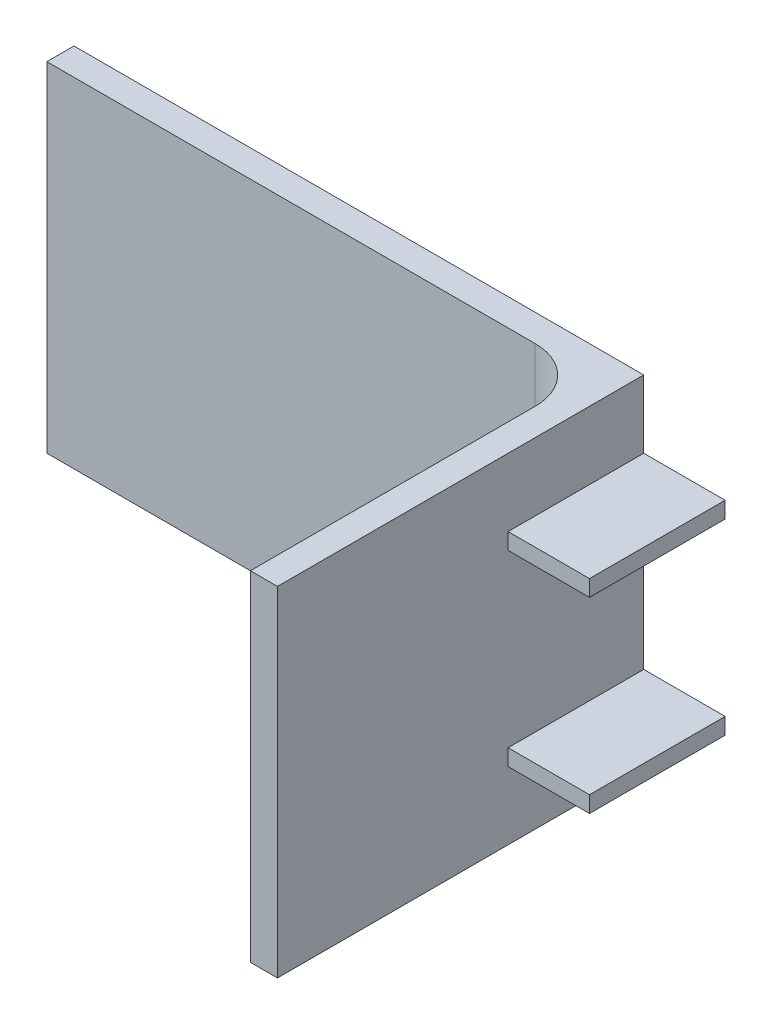
ISO-10303-21;
HEADER;
FILE_DESCRIPTION(('STEP AP214'),'2;1');
FILE_NAME('part.step','',(''),(''),'','','');
FILE_SCHEMA(('AUTOMOTIVE_DESIGN { 1 0 10303 214 1 1 1 1 }'));
ENDSEC;
DATA;
#1=APPLICATION_CONTEXT('core data for automotive mechanical design processes');
#2=APPLICATION_PROTOCOL_DEFINITION('international standard','automotive_design',2000,#1);
#3=PRODUCT_CONTEXT('',#1,'mechanical');
#4=PRODUCT('Part','Part','',(#3));
#5=PRODUCT_RELATED_PRODUCT_CATEGORY('part','',(#4));
#6=PRODUCT_DEFINITION_FORMATION('','',#4);
#7=PRODUCT_DEFINITION_CONTEXT('part definition',#1,'design');
#8=PRODUCT_DEFINITION('design','',#6,#7);
#9=PRODUCT_DEFINITION_SHAPE('','',#8);
#10=(LENGTH_UNIT() NAMED_UNIT(*) SI_UNIT(.MILLI.,.METRE.));
#11=(NAMED_UNIT(*) PLANE_ANGLE_UNIT() SI_UNIT($,.RADIAN.));
#12=(NAMED_UNIT(*) SI_UNIT($,.STERADIAN.) SOLID_ANGLE_UNIT());
#13=UNCERTAINTY_MEASURE_WITH_UNIT(LENGTH_MEASURE(1.E-05),#10,'distance_accuracy_value','');
#14=(GEOMETRIC_REPRESENTATION_CONTEXT(3) GLOBAL_UNCERTAINTY_ASSIGNED_CONTEXT((#13)) GLOBAL_UNIT_ASSIGNED_CONTEXT((#10,
#11,#12)) REPRESENTATION_CONTEXT('',''));
#15=CARTESIAN_POINT('',(0.,0.,0.));
#16=DIRECTION('',(0.,0.,1.));
#17=DIRECTION('',(1.,0.,0.));
#18=AXIS2_PLACEMENT_3D('',#15,#16,#17);
#19=CARTESIAN_POINT('',(0.,25.,2.));
#20=DIRECTION('',(-1.,0.,0.));
#21=DIRECTION('',(0.,0.,1.));
#22=AXIS2_PLACEMENT_3D('',#19,#20,#21);
#23=PLANE('',#22);
#24=DIRECTION('',(0.,0.,1.));
#25=VECTOR('',#24,1.);
#26=CARTESIAN_POINT('',(0.,6.2,0.));
#27=LINE('',#26,#25);
#28=CARTESIAN_POINT('',(0.,6.2,0.));
#29=VERTEX_POINT('',#28);
#30=CARTESIAN_POINT('',(0.,6.2,10.));
#31=VERTEX_POINT('',#30);
#32=EDGE_CURVE('E463',#29,#31,#27,.T.);
#33=ORIENTED_EDGE('',*,*,#32,.F.);
#34=DIRECTION('',(0.,1.,0.));
#35=VECTOR('',#34,1.);
#36=CARTESIAN_POINT('',(0.,25.,0.));
#37=LINE('',#36,#35);
#38=CARTESIAN_POINT('',(0.,18.8,0.));
#39=VERTEX_POINT('',#38);
#40=EDGE_CURVE('E163',#29,#39,#37,.T.);
#41=ORIENTED_EDGE('',*,*,#40,.T.);
#42=DIRECTION('',(0.,0.,-1.));
#43=VECTOR('',#42,1.);
#44=CARTESIAN_POINT('',(0.,18.8,0.));
#45=LINE('',#44,#43);
#46=CARTESIAN_POINT('',(0.,18.8,10.));
#47=VERTEX_POINT('',#46);
#48=EDGE_CURVE('E178',#47,#39,#45,.T.);
#49=ORIENTED_EDGE('',*,*,#48,.F.);
#50=DIRECTION('',(0.,-1.,0.));
#51=VECTOR('',#50,1.);
#52=CARTESIAN_POINT('',(0.,20.,10.));
#53=LINE('',#52,#51);
#54=CARTESIAN_POINT('',(0.,20.,10.));
#55=VERTEX_POINT('',#54);
#56=EDGE_CURVE('E168',#55,#47,#53,.T.);
#57=ORIENTED_EDGE('',*,*,#56,.F.);
#58=DIRECTION('',(0.,0.,1.));
#59=VECTOR('',#58,1.);
#60=CARTESIAN_POINT('',(0.,20.,0.));
#61=LINE('',#60,#59);
#62=CARTESIAN_POINT('',(0.,20.,0.));
#63=VERTEX_POINT('',#62);
#64=EDGE_CURVE('E165',#63,#55,#61,.T.);
#65=ORIENTED_EDGE('',*,*,#64,.F.);
#66=CARTESIAN_POINT('',(0.,25.,0.));
#67=VERTEX_POINT('',#66);
#68=EDGE_CURVE('E203',#63,#67,#37,.T.);
#69=ORIENTED_EDGE('',*,*,#68,.T.);
#70=DIRECTION('',(0.,0.,-1.));
#71=VECTOR('',#70,1.);
#72=CARTESIAN_POINT('',(0.,25.,2.));
#73=LINE('',#72,#71);
#74=CARTESIAN_POINT('',(0.,25.,27.));
#75=VERTEX_POINT('',#74);
#76=EDGE_CURVE('E252',#75,#67,#73,.T.);
#77=ORIENTED_EDGE('',*,*,#76,.F.);
#78=DIRECTION('',(0.,1.,0.));
#79=VECTOR('',#78,1.);
#80=CARTESIAN_POINT('',(0.,25.,27.));
#81=LINE('',#80,#79);
#82=CARTESIAN_POINT('',(0.,0.,27.));
#83=VERTEX_POINT('',#82);
#84=EDGE_CURVE('E277',#83,#75,#81,.T.);
#85=ORIENTED_EDGE('',*,*,#84,.F.);
#86=DIRECTION('',(0.,0.,-1.));
#87=VECTOR('',#86,1.);
#88=CARTESIAN_POINT('',(0.,0.,2.));
#89=LINE('',#88,#87);
#90=CARTESIAN_POINT('',(0.,0.,0.));
#91=VERTEX_POINT('',#90);
#92=EDGE_CURVE('E248',#83,#91,#89,.T.);
#93=ORIENTED_EDGE('',*,*,#92,.T.);
#94=CARTESIAN_POINT('',(0.,5.,0.));
#95=VERTEX_POINT('',#94);
#96=EDGE_CURVE('E202',#91,#95,#37,.T.);
#97=ORIENTED_EDGE('',*,*,#96,.T.);
#98=DIRECTION('',(0.,0.,-1.));
#99=VECTOR('',#98,1.);
#100=CARTESIAN_POINT('',(0.,5.,0.));
#101=LINE('',#100,#99);
#102=CARTESIAN_POINT('',(0.,5.,10.));
#103=VERTEX_POINT('',#102);
#104=EDGE_CURVE('E158',#103,#95,#101,.T.);
#105=ORIENTED_EDGE('',*,*,#104,.F.);
#106=DIRECTION('',(0.,-1.,0.));
#107=VECTOR('',#106,1.);
#108=CARTESIAN_POINT('',(0.,5.,10.));
#109=LINE('',#108,#107);
#110=EDGE_CURVE('E457',#31,#103,#109,.T.);
#111=ORIENTED_EDGE('',*,*,#110,.F.);
#112=EDGE_LOOP('',(#33,#41,#49,#57,#65,#69,#77,#85,#93,#97,#105,#111));
#113=FACE_BOUND('',#112,.T.);
#114=ADVANCED_FACE('F33',(#113),#23,.F.);
#115=CARTESIAN_POINT('',(-42.,25.,2.));
#116=DIRECTION('',(1.,0.,0.));
#117=DIRECTION('',(0.,0.,-1.));
#118=AXIS2_PLACEMENT_3D('',#115,#116,#117);
#119=PLANE('',#118);
#120=DIRECTION('',(0.,-1.,0.));
#121=VECTOR('',#120,1.);
#122=CARTESIAN_POINT('',(-42.,25.,0.));
#123=LINE('',#122,#121);
#124=CARTESIAN_POINT('',(-42.,25.,0.));
#125=VERTEX_POINT('',#124);
#126=CARTESIAN_POINT('',(-42.,0.,0.));
#127=VERTEX_POINT('',#126);
#128=EDGE_CURVE('E223',#125,#127,#123,.T.);
#129=ORIENTED_EDGE('',*,*,#128,.T.);
#130=DIRECTION('',(0.,0.,-1.));
#131=VECTOR('',#130,1.);
#132=CARTESIAN_POINT('',(-42.,0.,2.));
#133=LINE('',#132,#131);
#134=CARTESIAN_POINT('',(-42.,0.,2.));
#135=VERTEX_POINT('',#134);
#136=EDGE_CURVE('E234',#135,#127,#133,.T.);
#137=ORIENTED_EDGE('',*,*,#136,.F.);
#138=DIRECTION('',(0.,-1.,0.));
#139=VECTOR('',#138,1.);
#140=CARTESIAN_POINT('',(-42.,25.,2.));
#141=LINE('',#140,#139);
#142=CARTESIAN_POINT('',(-42.,25.,2.));
#143=VERTEX_POINT('',#142);
#144=EDGE_CURVE('E233',#143,#135,#141,.T.);
#145=ORIENTED_EDGE('',*,*,#144,.F.);
#146=DIRECTION('',(0.,0.,-1.));
#147=VECTOR('',#146,1.);
#148=CARTESIAN_POINT('',(-42.,25.,2.));
#149=LINE('',#148,#147);
#150=EDGE_CURVE('E242',#143,#125,#149,.T.);
#151=ORIENTED_EDGE('',*,*,#150,.T.);
#152=EDGE_LOOP('',(#129,#137,#145,#151));
#153=FACE_BOUND('',#152,.T.);
#154=ADVANCED_FACE('F262',(#153),#119,.F.);
#155=CARTESIAN_POINT('',(-42.,0.,2.));
#156=DIRECTION('',(0.,1.,0.));
#157=DIRECTION('',(0.,0.,1.));
#158=AXIS2_PLACEMENT_3D('',#155,#156,#157);
#159=PLANE('',#158);
#160=DIRECTION('',(1.,0.,0.));
#161=VECTOR('',#160,1.);
#162=CARTESIAN_POINT('',(-42.,0.,0.));
#163=LINE('',#162,#161);
#164=EDGE_CURVE('E209',#127,#91,#163,.T.);
#165=ORIENTED_EDGE('',*,*,#164,.T.);
#166=ORIENTED_EDGE('',*,*,#92,.F.);
#167=DIRECTION('',(1.,0.,0.));
#168=VECTOR('',#167,1.);
#169=CARTESIAN_POINT('',(0.,0.,27.));
#170=LINE('',#169,#168);
#171=CARTESIAN_POINT('',(-2.,0.,27.));
#172=VERTEX_POINT('',#171);
#173=EDGE_CURVE('E228',#172,#83,#170,.T.);
#174=ORIENTED_EDGE('',*,*,#173,.F.);
#175=DIRECTION('',(0.,0.,-1.));
#176=VECTOR('',#175,1.);
#177=CARTESIAN_POINT('',(-2.,0.,27.));
#178=LINE('',#177,#176);
#179=CARTESIAN_POINT('',(-2.,0.,6.));
#180=VERTEX_POINT('',#179);
#181=EDGE_CURVE('E224',#172,#180,#178,.T.);
#182=ORIENTED_EDGE('',*,*,#181,.T.);
#183=CARTESIAN_POINT('',(-6.,0.,6.));
#184=DIRECTION('',(0.,1.,0.));
#185=DIRECTION('',(0.,0.,1.));
#186=AXIS2_PLACEMENT_3D('',#183,#184,#185);
#187=CIRCLE('',#186,4.);
#188=CARTESIAN_POINT('',(-6.00000000000001,0.,2.));
#189=VERTEX_POINT('',#188);
#190=EDGE_CURVE('E41',#180,#189,#187,.T.);
#191=ORIENTED_EDGE('',*,*,#190,.T.);
#192=DIRECTION('',(1.,0.,0.));
#193=VECTOR('',#192,1.);
#194=CARTESIAN_POINT('',(-42.,0.,2.));
#195=LINE('',#194,#193);
#196=EDGE_CURVE('E229',#135,#189,#195,.T.);
#197=ORIENTED_EDGE('',*,*,#196,.F.);
#198=ORIENTED_EDGE('',*,*,#136,.T.);
#199=EDGE_LOOP('',(#165,#166,#174,#182,#191,#197,#198));
#200=FACE_BOUND('',#199,.T.);
#201=ADVANCED_FACE('F287',(#200),#159,.F.);
#202=CARTESIAN_POINT('',(-42.,25.,2.));
#203=DIRECTION('',(0.,-1.,0.));
#204=DIRECTION('',(1.,0.,0.));
#205=AXIS2_PLACEMENT_3D('',#202,#203,#204);
#206=PLANE('',#205);
#207=DIRECTION('',(-1.,0.,0.));
#208=VECTOR('',#207,1.);
#209=CARTESIAN_POINT('',(-42.,25.,0.));
#210=LINE('',#209,#208);
#211=EDGE_CURVE('E211',#67,#125,#210,.T.);
#212=ORIENTED_EDGE('',*,*,#211,.T.);
#213=ORIENTED_EDGE('',*,*,#150,.F.);
#214=DIRECTION('',(-1.,0.,0.));
#215=VECTOR('',#214,1.);
#216=CARTESIAN_POINT('',(-42.,25.,2.));
#217=LINE('',#216,#215);
#218=CARTESIAN_POINT('',(-6.00000000000001,25.,2.));
#219=VERTEX_POINT('',#218);
#220=EDGE_CURVE('E232',#219,#143,#217,.T.);
#221=ORIENTED_EDGE('',*,*,#220,.F.);
#222=CARTESIAN_POINT('',(-6.,25.,6.));
#223=DIRECTION('',(0.,-1.,0.));
#224=DIRECTION('',(1.,0.,0.));
#225=AXIS2_PLACEMENT_3D('',#222,#223,#224);
#226=CIRCLE('',#225,4.);
#227=CARTESIAN_POINT('',(-2.,25.,6.));
#228=VERTEX_POINT('',#227);
#229=EDGE_CURVE('E11',#219,#228,#226,.T.);
#230=ORIENTED_EDGE('',*,*,#229,.T.);
#231=DIRECTION('',(0.,0.,-1.));
#232=VECTOR('',#231,1.);
#233=CARTESIAN_POINT('',(-2.,25.,27.));
#234=LINE('',#233,#232);
#235=CARTESIAN_POINT('',(-2.,25.,27.));
#236=VERTEX_POINT('',#235);
#237=EDGE_CURVE('E220',#236,#228,#234,.T.);
#238=ORIENTED_EDGE('',*,*,#237,.F.);
#239=DIRECTION('',(-1.,0.,0.));
#240=VECTOR('',#239,1.);
#241=CARTESIAN_POINT('',(0.,25.,27.));
#242=LINE('',#241,#240);
#243=EDGE_CURVE('E272',#75,#236,#242,.T.);
#244=ORIENTED_EDGE('',*,*,#243,.F.);
#245=ORIENTED_EDGE('',*,*,#76,.T.);
#246=EDGE_LOOP('',(#212,#213,#221,#230,#238,#244,#245));
#247=FACE_BOUND('',#246,.T.);
#248=ADVANCED_FACE('F270',(#247),#206,.F.);
#249=CARTESIAN_POINT('',(0.,0.,2.));
#250=DIRECTION('',(0.,0.,1.));
#251=DIRECTION('',(1.,0.,0.));
#252=AXIS2_PLACEMENT_3D('',#249,#250,#251);
#253=PLANE('',#252);
#254=ORIENTED_EDGE('',*,*,#196,.T.);
#255=DIRECTION('',(0.,-1.,0.));
#256=VECTOR('',#255,1.);
#257=CARTESIAN_POINT('',(-6.,0.,2.));
#258=LINE('',#257,#256);
#259=EDGE_CURVE('E54',#189,#219,#258,.F.);
#260=ORIENTED_EDGE('',*,*,#259,.T.);
#261=ORIENTED_EDGE('',*,*,#220,.T.);
#262=ORIENTED_EDGE('',*,*,#144,.T.);
#263=EDGE_LOOP('',(#254,#260,#261,#262));
#264=FACE_BOUND('',#263,.T.);
#265=ADVANCED_FACE('F294',(#264),#253,.T.);
#266=CARTESIAN_POINT('',(0.,0.,0.));
#267=DIRECTION('',(0.,0.,1.));
#268=DIRECTION('',(1.,0.,0.));
#269=AXIS2_PLACEMENT_3D('',#266,#267,#268);
#270=PLANE('',#269);
#271=ORIENTED_EDGE('',*,*,#128,.F.);
#272=ORIENTED_EDGE('',*,*,#211,.F.);
#273=ORIENTED_EDGE('',*,*,#68,.F.);
#274=DIRECTION('',(-1.,0.,0.));
#275=VECTOR('',#274,1.);
#276=CARTESIAN_POINT('',(6.,20.,0.));
#277=LINE('',#276,#275);
#278=CARTESIAN_POINT('',(6.,20.,0.));
#279=VERTEX_POINT('',#278);
#280=EDGE_CURVE('E282',#279,#63,#277,.T.);
#281=ORIENTED_EDGE('',*,*,#280,.F.);
#282=DIRECTION('',(0.,1.,0.));
#283=VECTOR('',#282,1.);
#284=CARTESIAN_POINT('',(6.,20.,0.));
#285=LINE('',#284,#283);
#286=CARTESIAN_POINT('',(6.,18.8,0.));
#287=VERTEX_POINT('',#286);
#288=EDGE_CURVE('E174',#287,#279,#285,.T.);
#289=ORIENTED_EDGE('',*,*,#288,.F.);
#290=DIRECTION('',(-1.,0.,0.));
#291=VECTOR('',#290,1.);
#292=CARTESIAN_POINT('',(6.,18.8,0.));
#293=LINE('',#292,#291);
#294=EDGE_CURVE('E184',#287,#39,#293,.T.);
#295=ORIENTED_EDGE('',*,*,#294,.T.);
#296=ORIENTED_EDGE('',*,*,#40,.F.);
#297=DIRECTION('',(-1.,0.,0.));
#298=VECTOR('',#297,1.);
#299=CARTESIAN_POINT('',(6.,6.2,0.));
#300=LINE('',#299,#298);
#301=CARTESIAN_POINT('',(6.,6.2,0.));
#302=VERTEX_POINT('',#301);
#303=EDGE_CURVE('E143',#302,#29,#300,.T.);
#304=ORIENTED_EDGE('',*,*,#303,.F.);
#305=DIRECTION('',(0.,1.,0.));
#306=VECTOR('',#305,1.);
#307=CARTESIAN_POINT('',(6.,5.,0.));
#308=LINE('',#307,#306);
#309=CARTESIAN_POINT('',(6.,5.,0.));
#310=VERTEX_POINT('',#309);
#311=EDGE_CURVE('E149',#310,#302,#308,.T.);
#312=ORIENTED_EDGE('',*,*,#311,.F.);
#313=DIRECTION('',(-1.,0.,0.));
#314=VECTOR('',#313,1.);
#315=CARTESIAN_POINT('',(6.,5.,0.));
#316=LINE('',#315,#314);
#317=EDGE_CURVE('E454',#310,#95,#316,.T.);
#318=ORIENTED_EDGE('',*,*,#317,.T.);
#319=ORIENTED_EDGE('',*,*,#96,.F.);
#320=ORIENTED_EDGE('',*,*,#164,.F.);
#321=EDGE_LOOP('',(#271,#272,#273,#281,#289,#295,#296,#304,#312,#318,#319,#320));
#322=FACE_BOUND('',#321,.T.);
#323=ADVANCED_FACE('F161',(#322),#270,.F.);
#324=CARTESIAN_POINT('',(-2.,25.,27.));
#325=DIRECTION('',(1.,0.,0.));
#326=DIRECTION('',(0.,1.,0.));
#327=AXIS2_PLACEMENT_3D('',#324,#325,#326);
#328=PLANE('',#327);
#329=ORIENTED_EDGE('',*,*,#237,.T.);
#330=DIRECTION('',(0.,-1.,0.));
#331=VECTOR('',#330,1.);
#332=CARTESIAN_POINT('',(-2.,25.,6.));
#333=LINE('',#332,#331);
#334=EDGE_CURVE('E204',#228,#180,#333,.T.);
#335=ORIENTED_EDGE('',*,*,#334,.T.);
#336=ORIENTED_EDGE('',*,*,#181,.F.);
#337=DIRECTION('',(0.,-1.,0.));
#338=VECTOR('',#337,1.);
#339=CARTESIAN_POINT('',(-2.,25.,27.));
#340=LINE('',#339,#338);
#341=EDGE_CURVE('E276',#236,#172,#340,.T.);
#342=ORIENTED_EDGE('',*,*,#341,.F.);
#343=EDGE_LOOP('',(#329,#335,#336,#342));
#344=FACE_BOUND('',#343,.T.);
#345=ADVANCED_FACE('F286',(#344),#328,.F.);
#346=CARTESIAN_POINT('',(0.,0.,27.));
#347=DIRECTION('',(0.,0.,-1.));
#348=DIRECTION('',(-1.,0.,0.));
#349=AXIS2_PLACEMENT_3D('',#346,#347,#348);
#350=PLANE('',#349);
#351=ORIENTED_EDGE('',*,*,#84,.T.);
#352=ORIENTED_EDGE('',*,*,#243,.T.);
#353=ORIENTED_EDGE('',*,*,#341,.T.);
#354=ORIENTED_EDGE('',*,*,#173,.T.);
#355=EDGE_LOOP('',(#351,#352,#353,#354));
#356=FACE_BOUND('',#355,.T.);
#357=ADVANCED_FACE('F280',(#356),#350,.F.);
#358=CARTESIAN_POINT('',(6.,20.,0.));
#359=DIRECTION('',(0.,-1.,0.));
#360=DIRECTION('',(0.,0.,-1.));
#361=AXIS2_PLACEMENT_3D('',#358,#359,#360);
#362=PLANE('',#361);
#363=ORIENTED_EDGE('',*,*,#64,.T.);
#364=DIRECTION('',(-1.,0.,0.));
#365=VECTOR('',#364,1.);
#366=CARTESIAN_POINT('',(6.,20.,10.));
#367=LINE('',#366,#365);
#368=CARTESIAN_POINT('',(6.,20.,10.));
#369=VERTEX_POINT('',#368);
#370=EDGE_CURVE('E284',#369,#55,#367,.T.);
#371=ORIENTED_EDGE('',*,*,#370,.F.);
#372=DIRECTION('',(0.,0.,1.));
#373=VECTOR('',#372,1.);
#374=CARTESIAN_POINT('',(6.,20.,0.));
#375=LINE('',#374,#373);
#376=EDGE_CURVE('E177',#279,#369,#375,.T.);
#377=ORIENTED_EDGE('',*,*,#376,.F.);
#378=ORIENTED_EDGE('',*,*,#280,.T.);
#379=EDGE_LOOP('',(#363,#371,#377,#378));
#380=FACE_BOUND('',#379,.T.);
#381=ADVANCED_FACE('F312',(#380),#362,.F.);
#382=CARTESIAN_POINT('',(6.,20.,10.));
#383=DIRECTION('',(0.,0.,-1.));
#384=DIRECTION('',(-1.,0.,0.));
#385=AXIS2_PLACEMENT_3D('',#382,#383,#384);
#386=PLANE('',#385);
#387=ORIENTED_EDGE('',*,*,#56,.T.);
#388=DIRECTION('',(-1.,0.,0.));
#389=VECTOR('',#388,1.);
#390=CARTESIAN_POINT('',(6.,18.8,10.));
#391=LINE('',#390,#389);
#392=CARTESIAN_POINT('',(6.,18.8,10.));
#393=VERTEX_POINT('',#392);
#394=EDGE_CURVE('E189',#393,#47,#391,.T.);
#395=ORIENTED_EDGE('',*,*,#394,.F.);
#396=DIRECTION('',(0.,-1.,0.));
#397=VECTOR('',#396,1.);
#398=CARTESIAN_POINT('',(6.,20.,10.));
#399=LINE('',#398,#397);
#400=EDGE_CURVE('E180',#369,#393,#399,.T.);
#401=ORIENTED_EDGE('',*,*,#400,.F.);
#402=ORIENTED_EDGE('',*,*,#370,.T.);
#403=EDGE_LOOP('',(#387,#395,#401,#402));
#404=FACE_BOUND('',#403,.T.);
#405=ADVANCED_FACE('F315',(#404),#386,.F.);
#406=CARTESIAN_POINT('',(6.,18.8,0.));
#407=DIRECTION('',(0.,1.,0.));
#408=DIRECTION('',(0.,0.,1.));
#409=AXIS2_PLACEMENT_3D('',#406,#407,#408);
#410=PLANE('',#409);
#411=ORIENTED_EDGE('',*,*,#48,.T.);
#412=ORIENTED_EDGE('',*,*,#294,.F.);
#413=DIRECTION('',(0.,0.,-1.));
#414=VECTOR('',#413,1.);
#415=CARTESIAN_POINT('',(6.,18.8,0.));
#416=LINE('',#415,#414);
#417=EDGE_CURVE('E182',#393,#287,#416,.T.);
#418=ORIENTED_EDGE('',*,*,#417,.F.);
#419=ORIENTED_EDGE('',*,*,#394,.T.);
#420=EDGE_LOOP('',(#411,#412,#418,#419));
#421=FACE_BOUND('',#420,.T.);
#422=ADVANCED_FACE('F319',(#421),#410,.F.);
#423=CARTESIAN_POINT('',(6.,0.,0.));
#424=DIRECTION('',(-1.,0.,0.));
#425=DIRECTION('',(0.,0.,1.));
#426=AXIS2_PLACEMENT_3D('',#423,#424,#425);
#427=PLANE('',#426);
#428=ORIENTED_EDGE('',*,*,#288,.T.);
#429=ORIENTED_EDGE('',*,*,#376,.T.);
#430=ORIENTED_EDGE('',*,*,#400,.T.);
#431=ORIENTED_EDGE('',*,*,#417,.T.);
#432=EDGE_LOOP('',(#428,#429,#430,#431));
#433=FACE_BOUND('',#432,.T.);
#434=ADVANCED_FACE('F323',(#433),#427,.F.);
#435=CARTESIAN_POINT('',(6.,6.2,0.));
#436=DIRECTION('',(0.,-1.,0.));
#437=DIRECTION('',(0.,0.,-1.));
#438=AXIS2_PLACEMENT_3D('',#435,#436,#437);
#439=PLANE('',#438);
#440=ORIENTED_EDGE('',*,*,#32,.T.);
#441=DIRECTION('',(-1.,0.,0.));
#442=VECTOR('',#441,1.);
#443=CARTESIAN_POINT('',(6.,6.2,10.));
#444=LINE('',#443,#442);
#445=CARTESIAN_POINT('',(6.,6.2,10.));
#446=VERTEX_POINT('',#445);
#447=EDGE_CURVE('E145',#446,#31,#444,.T.);
#448=ORIENTED_EDGE('',*,*,#447,.F.);
#449=DIRECTION('',(0.,0.,1.));
#450=VECTOR('',#449,1.);
#451=CARTESIAN_POINT('',(6.,6.2,0.));
#452=LINE('',#451,#450);
#453=EDGE_CURVE('E138',#302,#446,#452,.T.);
#454=ORIENTED_EDGE('',*,*,#453,.F.);
#455=ORIENTED_EDGE('',*,*,#303,.T.);
#456=EDGE_LOOP('',(#440,#448,#454,#455));
#457=FACE_BOUND('',#456,.T.);
#458=ADVANCED_FACE('F141',(#457),#439,.F.);
#459=CARTESIAN_POINT('',(6.,5.,10.));
#460=DIRECTION('',(0.,0.,-1.));
#461=DIRECTION('',(-1.,0.,0.));
#462=AXIS2_PLACEMENT_3D('',#459,#460,#461);
#463=PLANE('',#462);
#464=ORIENTED_EDGE('',*,*,#110,.T.);
#465=DIRECTION('',(-1.,0.,0.));
#466=VECTOR('',#465,1.);
#467=CARTESIAN_POINT('',(6.,5.,10.));
#468=LINE('',#467,#466);
#469=CARTESIAN_POINT('',(6.,5.,10.));
#470=VERTEX_POINT('',#469);
#471=EDGE_CURVE('E170',#470,#103,#468,.T.);
#472=ORIENTED_EDGE('',*,*,#471,.F.);
#473=DIRECTION('',(0.,-1.,0.));
#474=VECTOR('',#473,1.);
#475=CARTESIAN_POINT('',(6.,5.,10.));
#476=LINE('',#475,#474);
#477=EDGE_CURVE('E148',#446,#470,#476,.T.);
#478=ORIENTED_EDGE('',*,*,#477,.F.);
#479=ORIENTED_EDGE('',*,*,#447,.T.);
#480=EDGE_LOOP('',(#464,#472,#478,#479));
#481=FACE_BOUND('',#480,.T.);
#482=ADVANCED_FACE('F330',(#481),#463,.F.);
#483=CARTESIAN_POINT('',(6.,5.,0.));
#484=DIRECTION('',(0.,1.,0.));
#485=DIRECTION('',(0.,0.,1.));
#486=AXIS2_PLACEMENT_3D('',#483,#484,#485);
#487=PLANE('',#486);
#488=ORIENTED_EDGE('',*,*,#104,.T.);
#489=ORIENTED_EDGE('',*,*,#317,.F.);
#490=DIRECTION('',(0.,0.,-1.));
#491=VECTOR('',#490,1.);
#492=CARTESIAN_POINT('',(6.,5.,0.));
#493=LINE('',#492,#491);
#494=EDGE_CURVE('E154',#470,#310,#493,.T.);
#495=ORIENTED_EDGE('',*,*,#494,.F.);
#496=ORIENTED_EDGE('',*,*,#471,.T.);
#497=EDGE_LOOP('',(#488,#489,#495,#496));
#498=FACE_BOUND('',#497,.T.);
#499=ADVANCED_FACE('F333',(#498),#487,.F.);
#500=CARTESIAN_POINT('',(6.,0.,0.));
#501=DIRECTION('',(1.,0.,0.));
#502=DIRECTION('',(0.,0.,-1.));
#503=AXIS2_PLACEMENT_3D('',#500,#501,#502);
#504=PLANE('',#503);
#505=ORIENTED_EDGE('',*,*,#311,.T.);
#506=ORIENTED_EDGE('',*,*,#453,.T.);
#507=ORIENTED_EDGE('',*,*,#477,.T.);
#508=ORIENTED_EDGE('',*,*,#494,.T.);
#509=EDGE_LOOP('',(#505,#506,#507,#508));
#510=FACE_BOUND('',#509,.T.);
#511=ADVANCED_FACE('F152',(#510),#504,.T.);
#512=CARTESIAN_POINT('',(-6.,25.,6.));
#513=DIRECTION('',(0.,-1.,0.));
#514=DIRECTION('',(1.,0.,0.));
#515=AXIS2_PLACEMENT_3D('',#512,#513,#514);
#516=CYLINDRICAL_SURFACE('',#515,4.);
#517=ORIENTED_EDGE('',*,*,#229,.F.);
#518=ORIENTED_EDGE('',*,*,#259,.F.);
#519=ORIENTED_EDGE('',*,*,#190,.F.);
#520=ORIENTED_EDGE('',*,*,#334,.F.);
#521=EDGE_LOOP('',(#517,#518,#519,#520));
#522=FACE_BOUND('',#521,.T.);
#523=ADVANCED_FACE('F35',(#522),#516,.F.);
#524=CLOSED_SHELL('',(#114,#154,#201,#248,#265,#323,#345,#357,#381,#405,#422,#434,#458,#482,
#499,#511,#523));
#525=MANIFOLD_SOLID_BREP('B2',#524);
#526=ADVANCED_BREP_SHAPE_REPRESENTATION('',(#18,#525),#14);
#527=SHAPE_DEFINITION_REPRESENTATION(#9,#526);
ENDSEC;
END-ISO-10303-21;
